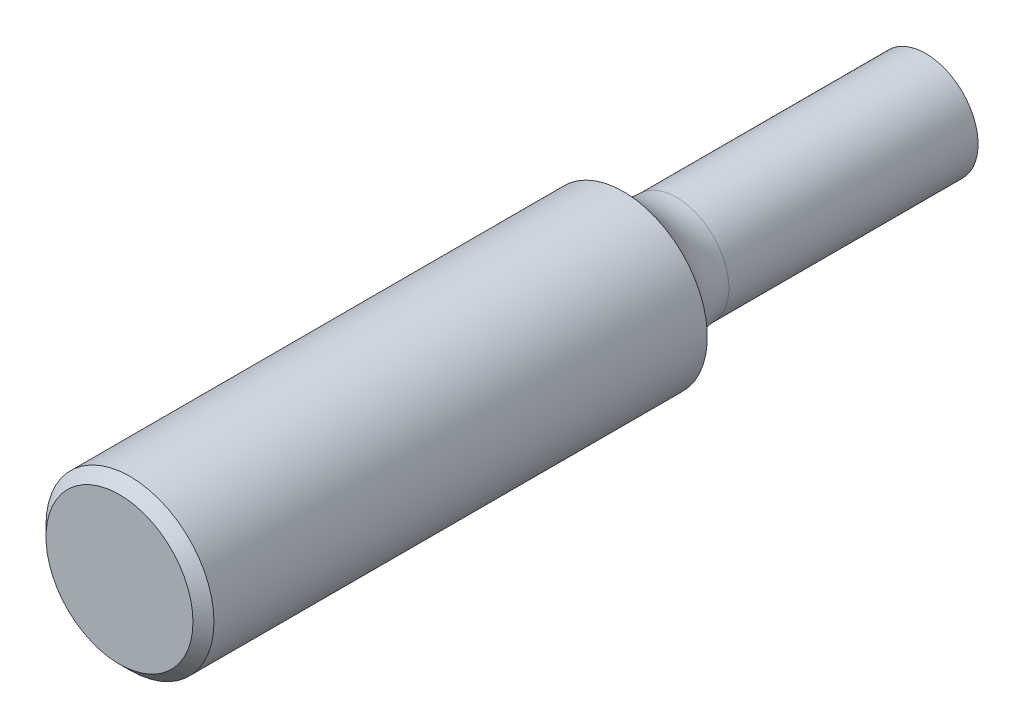
ISO-10303-21;
HEADER;
FILE_DESCRIPTION(('STEP AP214'),'2;1');
FILE_NAME('part.step','',(''),(''),'','','');
FILE_SCHEMA(('AUTOMOTIVE_DESIGN { 1 0 10303 214 1 1 1 1 }'));
ENDSEC;
DATA;
#1=APPLICATION_CONTEXT('core data for automotive mechanical design processes');
#2=APPLICATION_PROTOCOL_DEFINITION('international standard','automotive_design',2000,#1);
#3=PRODUCT_CONTEXT('',#1,'mechanical');
#4=PRODUCT('Part','Part','',(#3));
#5=PRODUCT_RELATED_PRODUCT_CATEGORY('part','',(#4));
#6=PRODUCT_DEFINITION_FORMATION('','',#4);
#7=PRODUCT_DEFINITION_CONTEXT('part definition',#1,'design');
#8=PRODUCT_DEFINITION('design','',#6,#7);
#9=PRODUCT_DEFINITION_SHAPE('','',#8);
#10=(LENGTH_UNIT() NAMED_UNIT(*) SI_UNIT(.MILLI.,.METRE.));
#11=(NAMED_UNIT(*) PLANE_ANGLE_UNIT() SI_UNIT($,.RADIAN.));
#12=(NAMED_UNIT(*) SI_UNIT($,.STERADIAN.) SOLID_ANGLE_UNIT());
#13=UNCERTAINTY_MEASURE_WITH_UNIT(LENGTH_MEASURE(1.E-05),#10,'distance_accuracy_value','');
#14=(GEOMETRIC_REPRESENTATION_CONTEXT(3) GLOBAL_UNCERTAINTY_ASSIGNED_CONTEXT((#13)) GLOBAL_UNIT_ASSIGNED_CONTEXT((#10,
#11,#12)) REPRESENTATION_CONTEXT('',''));
#15=CARTESIAN_POINT('',(0.,0.,0.));
#16=DIRECTION('',(0.,0.,1.));
#17=DIRECTION('',(1.,0.,0.));
#18=AXIS2_PLACEMENT_3D('',#15,#16,#17);
#19=CARTESIAN_POINT('',(0.,1.98119999999999,-15.24));
#20=DIRECTION('',(0.,0.,-1.));
#21=DIRECTION('',(-1.,0.,0.));
#22=AXIS2_PLACEMENT_3D('',#19,#20,#21);
#23=PLANE('',#22);
#24=CARTESIAN_POINT('',(0.,0.,-15.24));
#25=DIRECTION('',(0.,0.,-1.));
#26=DIRECTION('',(-1.,0.,0.));
#27=AXIS2_PLACEMENT_3D('',#24,#25,#26);
#28=CIRCLE('',#27,1.72271181571383);
#29=CARTESIAN_POINT('',(-1.72271181571383,0.,-15.24));
#30=VERTEX_POINT('',#29);
#31=EDGE_CURVE('E60',#30,#30,#28,.T.);
#32=ORIENTED_EDGE('',*,*,#31,.F.);
#33=EDGE_LOOP('',(#32));
#34=FACE_BOUND('',#33,.T.);
#35=CARTESIAN_POINT('',(0.,0.,-15.24));
#36=DIRECTION('',(0.,0.,-1.));
#37=DIRECTION('',(-1.,0.,0.));
#38=AXIS2_PLACEMENT_3D('',#35,#36,#37);
#39=CIRCLE('',#38,1.9812);
#40=CARTESIAN_POINT('',(-1.9812,0.,-15.24));
#41=VERTEX_POINT('',#40);
#42=EDGE_CURVE('E48',#41,#41,#39,.T.);
#43=ORIENTED_EDGE('',*,*,#42,.T.);
#44=EDGE_LOOP('',(#43));
#45=FACE_BOUND('',#44,.T.);
#46=ADVANCED_FACE('F36',(#34,#45),#23,.T.);
#47=CARTESIAN_POINT('',(0.,0.,-127.));
#48=DIRECTION('',(0.,0.,-1.));
#49=DIRECTION('',(-1.,0.,0.));
#50=AXIS2_PLACEMENT_3D('',#47,#48,#49);
#51=CYLINDRICAL_SURFACE('',#50,1.9812);
#52=CARTESIAN_POINT('',(0.,0.,-5.81820695148681));
#53=DIRECTION('',(0.,0.,-1.));
#54=DIRECTION('',(-1.,0.,0.));
#55=AXIS2_PLACEMENT_3D('',#52,#53,#54);
#56=CIRCLE('',#55,1.9812);
#57=CARTESIAN_POINT('',(-1.9812,0.,-5.81820695148681));
#58=VERTEX_POINT('',#57);
#59=EDGE_CURVE('E52',#58,#58,#56,.T.);
#60=ORIENTED_EDGE('',*,*,#59,.T.);
#61=EDGE_LOOP('',(#60));
#62=FACE_BOUND('',#61,.T.);
#63=ORIENTED_EDGE('',*,*,#42,.F.);
#64=EDGE_LOOP('',(#63));
#65=FACE_BOUND('',#64,.T.);
#66=ADVANCED_FACE('F68',(#62,#65),#51,.T.);
#67=CARTESIAN_POINT('',(0.,0.,-5.81820695148682));
#68=DIRECTION('',(0.,0.,-1.));
#69=DIRECTION('',(-1.,0.,0.));
#70=AXIS2_PLACEMENT_3D('',#67,#68,#69);
#71=TOROIDAL_SURFACE('',#70,4.2672,2.286);
#72=CARTESIAN_POINT('',(0.,0.,-3.80999999999999));
#73=DIRECTION('',(0.,0.,-1.));
#74=DIRECTION('',(-1.,0.,0.));
#75=AXIS2_PLACEMENT_3D('',#72,#73,#74);
#76=CIRCLE('',#75,3.17499999999999);
#77=CARTESIAN_POINT('',(-3.17499999999999,0.,-3.80999999999999));
#78=VERTEX_POINT('',#77);
#79=EDGE_CURVE('E57',#78,#78,#76,.T.);
#80=ORIENTED_EDGE('',*,*,#79,.T.);
#81=EDGE_LOOP('',(#80));
#82=FACE_BOUND('',#81,.T.);
#83=ORIENTED_EDGE('',*,*,#59,.F.);
#84=EDGE_LOOP('',(#83));
#85=FACE_BOUND('',#84,.T.);
#86=ADVANCED_FACE('F72',(#82,#85),#71,.F.);
#87=CARTESIAN_POINT('',(0.,0.,-127.));
#88=DIRECTION('',(0.,0.,-1.));
#89=DIRECTION('',(-1.,0.,0.));
#90=AXIS2_PLACEMENT_3D('',#87,#88,#89);
#91=CYLINDRICAL_SURFACE('',#90,3.17499999999999);
#92=CARTESIAN_POINT('',(0.,0.,14.843125));
#93=DIRECTION('',(0.,0.,1.));
#94=DIRECTION('',(1.,0.,0.));
#95=AXIS2_PLACEMENT_3D('',#92,#93,#94);
#96=CIRCLE('',#95,3.17499999999999);
#97=CARTESIAN_POINT('',(3.17499999999999,0.,14.843125));
#98=VERTEX_POINT('',#97);
#99=EDGE_CURVE('E44',#98,#98,#96,.F.);
#100=ORIENTED_EDGE('',*,*,#99,.T.);
#101=EDGE_LOOP('',(#100));
#102=FACE_BOUND('',#101,.T.);
#103=ORIENTED_EDGE('',*,*,#79,.F.);
#104=EDGE_LOOP('',(#103));
#105=FACE_BOUND('',#104,.T.);
#106=ADVANCED_FACE('F78',(#102,#105),#91,.T.);
#107=CARTESIAN_POINT('',(0.,0.,15.24));
#108=DIRECTION('',(0.,0.,1.));
#109=DIRECTION('',(1.,0.,0.));
#110=AXIS2_PLACEMENT_3D('',#107,#108,#109);
#111=PLANE('',#110);
#112=CARTESIAN_POINT('',(0.,0.,15.24));
#113=DIRECTION('',(0.,0.,1.));
#114=DIRECTION('',(1.,0.,0.));
#115=AXIS2_PLACEMENT_3D('',#112,#113,#114);
#116=CIRCLE('',#115,2.77812499999998);
#117=CARTESIAN_POINT('',(2.77812499999998,0.,15.24));
#118=VERTEX_POINT('',#117);
#119=EDGE_CURVE('E10',#118,#118,#116,.T.);
#120=ORIENTED_EDGE('',*,*,#119,.T.);
#121=EDGE_LOOP('',(#120));
#122=FACE_BOUND('',#121,.T.);
#123=ADVANCED_FACE('F84',(#122),#111,.T.);
#124=CARTESIAN_POINT('',(0.,0.,-17.907));
#125=DIRECTION('',(0.,0.,-1.));
#126=DIRECTION('',(0.,-1.,0.));
#127=AXIS2_PLACEMENT_3D('',#124,#125,#126);
#128=SPHERICAL_SURFACE('',#127,3.175);
#129=ORIENTED_EDGE('',*,*,#31,.T.);
#130=EDGE_LOOP('',(#129));
#131=FACE_BOUND('',#130,.T.);
#132=ADVANCED_FACE('F64',(#131),#128,.F.);
#133=CARTESIAN_POINT('',(0.,0.,14.843125));
#134=DIRECTION('',(0.,0.,-1.));
#135=DIRECTION('',(-1.,0.,0.));
#136=AXIS2_PLACEMENT_3D('',#133,#134,#135);
#137=CONICAL_SURFACE('',#136,3.17499999999999,0.78539816339744);
#138=ORIENTED_EDGE('',*,*,#119,.F.);
#139=EDGE_LOOP('',(#138));
#140=FACE_BOUND('',#139,.T.);
#141=ORIENTED_EDGE('',*,*,#99,.F.);
#142=EDGE_LOOP('',(#141));
#143=FACE_BOUND('',#142,.T.);
#144=ADVANCED_FACE('F39',(#140,#143),#137,.T.);
#145=CLOSED_SHELL('',(#46,#66,#86,#106,#123,#132,#144));
#146=MANIFOLD_SOLID_BREP('B2',#145);
#147=ADVANCED_BREP_SHAPE_REPRESENTATION('',(#18,#146),#14);
#148=SHAPE_DEFINITION_REPRESENTATION(#9,#147);
ENDSEC;
END-ISO-10303-21;
